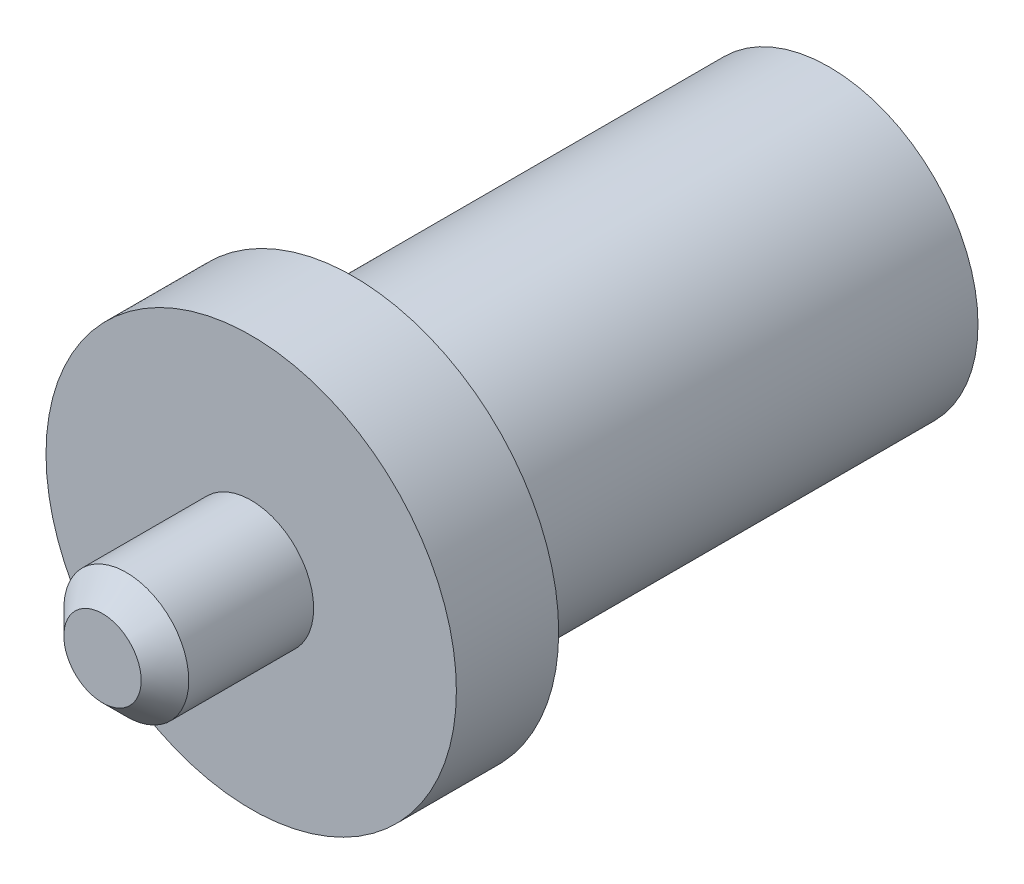
ISO-10303-21;
HEADER;
FILE_DESCRIPTION(('STEP AP214'),'2;1');
FILE_NAME('part.step','',(''),(''),'','','');
FILE_SCHEMA(('AUTOMOTIVE_DESIGN { 1 0 10303 214 1 1 1 1 }'));
ENDSEC;
DATA;
#1=APPLICATION_CONTEXT('core data for automotive mechanical design processes');
#2=APPLICATION_PROTOCOL_DEFINITION('international standard','automotive_design',2000,#1);
#3=PRODUCT_CONTEXT('',#1,'mechanical');
#4=PRODUCT('Part','Part','',(#3));
#5=PRODUCT_RELATED_PRODUCT_CATEGORY('part','',(#4));
#6=PRODUCT_DEFINITION_FORMATION('','',#4);
#7=PRODUCT_DEFINITION_CONTEXT('part definition',#1,'design');
#8=PRODUCT_DEFINITION('design','',#6,#7);
#9=PRODUCT_DEFINITION_SHAPE('','',#8);
#10=(LENGTH_UNIT() NAMED_UNIT(*) SI_UNIT(.MILLI.,.METRE.));
#11=(NAMED_UNIT(*) PLANE_ANGLE_UNIT() SI_UNIT($,.RADIAN.));
#12=(NAMED_UNIT(*) SI_UNIT($,.STERADIAN.) SOLID_ANGLE_UNIT());
#13=UNCERTAINTY_MEASURE_WITH_UNIT(LENGTH_MEASURE(1.E-05),#10,'distance_accuracy_value','');
#14=(GEOMETRIC_REPRESENTATION_CONTEXT(3) GLOBAL_UNCERTAINTY_ASSIGNED_CONTEXT((#13)) GLOBAL_UNIT_ASSIGNED_CONTEXT((#10,
#11,#12)) REPRESENTATION_CONTEXT('',''));
#15=CARTESIAN_POINT('',(0.,0.,0.));
#16=DIRECTION('',(0.,0.,1.));
#17=DIRECTION('',(1.,0.,0.));
#18=AXIS2_PLACEMENT_3D('',#15,#16,#17);
#19=CARTESIAN_POINT('',(0.,0.,0.));
#20=DIRECTION('',(0.,0.,1.));
#21=DIRECTION('',(1.,0.,0.));
#22=AXIS2_PLACEMENT_3D('',#19,#20,#21);
#23=PLANE('',#22);
#24=CARTESIAN_POINT('',(0.,0.,0.));
#25=DIRECTION('',(0.,0.,1.));
#26=DIRECTION('',(1.,0.,0.));
#27=AXIS2_PLACEMENT_3D('',#24,#25,#26);
#28=CIRCLE('',#27,3.45);
#29=CARTESIAN_POINT('',(3.45,0.,0.));
#30=VERTEX_POINT('',#29);
#31=EDGE_CURVE('E49',#30,#30,#28,.T.);
#32=ORIENTED_EDGE('',*,*,#31,.T.);
#33=EDGE_LOOP('',(#32));
#34=FACE_BOUND('',#33,.T.);
#35=CARTESIAN_POINT('',(0.,0.,0.));
#36=DIRECTION('',(0.,0.,1.));
#37=DIRECTION('',(1.,0.,0.));
#38=AXIS2_PLACEMENT_3D('',#35,#36,#37);
#39=CIRCLE('',#38,1.05);
#40=CARTESIAN_POINT('',(1.05,0.,0.));
#41=VERTEX_POINT('',#40);
#42=EDGE_CURVE('E57',#41,#41,#39,.T.);
#43=ORIENTED_EDGE('',*,*,#42,.F.);
#44=EDGE_LOOP('',(#43));
#45=FACE_BOUND('',#44,.T.);
#46=ADVANCED_FACE('F31',(#34,#45),#23,.T.);
#47=CARTESIAN_POINT('',(0.,0.,-1.72));
#48=DIRECTION('',(0.,0.,1.));
#49=DIRECTION('',(1.,0.,0.));
#50=AXIS2_PLACEMENT_3D('',#47,#48,#49);
#51=PLANE('',#50);
#52=CARTESIAN_POINT('',(0.,0.,-1.72));
#53=DIRECTION('',(0.,0.,1.));
#54=DIRECTION('',(1.,0.,0.));
#55=AXIS2_PLACEMENT_3D('',#52,#53,#54);
#56=CIRCLE('',#55,3.45);
#57=CARTESIAN_POINT('',(3.45,0.,-1.72));
#58=VERTEX_POINT('',#57);
#59=EDGE_CURVE('E46',#58,#58,#56,.T.);
#60=ORIENTED_EDGE('',*,*,#59,.F.);
#61=EDGE_LOOP('',(#60));
#62=FACE_BOUND('',#61,.T.);
#63=CARTESIAN_POINT('',(0.,0.,-1.72));
#64=DIRECTION('',(0.,0.,1.));
#65=DIRECTION('',(1.,0.,0.));
#66=AXIS2_PLACEMENT_3D('',#63,#64,#65);
#67=CIRCLE('',#66,2.5);
#68=CARTESIAN_POINT('',(2.5,0.,-1.72));
#69=VERTEX_POINT('',#68);
#70=EDGE_CURVE('E42',#69,#69,#67,.F.);
#71=ORIENTED_EDGE('',*,*,#70,.F.);
#72=EDGE_LOOP('',(#71));
#73=FACE_BOUND('',#72,.T.);
#74=ADVANCED_FACE('F64',(#62,#73),#51,.F.);
#75=CARTESIAN_POINT('',(0.,0.,-1.72));
#76=DIRECTION('',(0.,0.,1.));
#77=DIRECTION('',(1.,0.,0.));
#78=AXIS2_PLACEMENT_3D('',#75,#76,#77);
#79=CYLINDRICAL_SURFACE('',#78,3.45);
#80=ORIENTED_EDGE('',*,*,#59,.T.);
#81=EDGE_LOOP('',(#80));
#82=FACE_BOUND('',#81,.T.);
#83=ORIENTED_EDGE('',*,*,#31,.F.);
#84=EDGE_LOOP('',(#83));
#85=FACE_BOUND('',#84,.T.);
#86=ADVANCED_FACE('F70',(#82,#85),#79,.T.);
#87=CARTESIAN_POINT('',(0.,0.,-9.72));
#88=DIRECTION('',(0.,0.,1.));
#89=DIRECTION('',(1.,0.,0.));
#90=AXIS2_PLACEMENT_3D('',#87,#88,#89);
#91=CYLINDRICAL_SURFACE('',#90,2.5);
#92=CARTESIAN_POINT('',(0.,0.,-9.72));
#93=DIRECTION('',(0.,0.,-1.));
#94=DIRECTION('',(-1.,0.,0.));
#95=AXIS2_PLACEMENT_3D('',#92,#93,#94);
#96=CIRCLE('',#95,2.5);
#97=CARTESIAN_POINT('',(-2.5,0.,-9.72));
#98=VERTEX_POINT('',#97);
#99=EDGE_CURVE('E52',#98,#98,#96,.T.);
#100=ORIENTED_EDGE('',*,*,#99,.F.);
#101=EDGE_LOOP('',(#100));
#102=FACE_BOUND('',#101,.T.);
#103=ORIENTED_EDGE('',*,*,#70,.T.);
#104=EDGE_LOOP('',(#103));
#105=FACE_BOUND('',#104,.T.);
#106=ADVANCED_FACE('F75',(#102,#105),#91,.T.);
#107=CARTESIAN_POINT('',(0.,0.,-9.72));
#108=DIRECTION('',(0.,0.,-1.));
#109=DIRECTION('',(-1.,0.,0.));
#110=AXIS2_PLACEMENT_3D('',#107,#108,#109);
#111=PLANE('',#110);
#112=ORIENTED_EDGE('',*,*,#99,.T.);
#113=EDGE_LOOP('',(#112));
#114=FACE_BOUND('',#113,.T.);
#115=ADVANCED_FACE('F80',(#114),#111,.T.);
#116=CARTESIAN_POINT('',(0.,0.,2.5));
#117=DIRECTION('',(0.,0.,-1.));
#118=DIRECTION('',(-1.,0.,0.));
#119=AXIS2_PLACEMENT_3D('',#116,#117,#118);
#120=CYLINDRICAL_SURFACE('',#119,1.05);
#121=CARTESIAN_POINT('',(0.,0.,2.1));
#122=DIRECTION('',(0.,0.,1.));
#123=DIRECTION('',(1.,0.,0.));
#124=AXIS2_PLACEMENT_3D('',#121,#122,#123);
#125=CIRCLE('',#124,1.05);
#126=CARTESIAN_POINT('',(1.05,0.,2.1));
#127=VERTEX_POINT('',#126);
#128=EDGE_CURVE('E10',#127,#127,#125,.F.);
#129=ORIENTED_EDGE('',*,*,#128,.T.);
#130=EDGE_LOOP('',(#129));
#131=FACE_BOUND('',#130,.T.);
#132=ORIENTED_EDGE('',*,*,#42,.T.);
#133=EDGE_LOOP('',(#132));
#134=FACE_BOUND('',#133,.T.);
#135=ADVANCED_FACE('F61',(#131,#134),#120,.T.);
#136=CARTESIAN_POINT('',(0.,0.,2.5));
#137=DIRECTION('',(0.,0.,1.));
#138=DIRECTION('',(1.,0.,0.));
#139=AXIS2_PLACEMENT_3D('',#136,#137,#138);
#140=PLANE('',#139);
#141=CARTESIAN_POINT('',(0.,0.,2.5));
#142=DIRECTION('',(0.,0.,1.));
#143=DIRECTION('',(1.,0.,0.));
#144=AXIS2_PLACEMENT_3D('',#141,#142,#143);
#145=CIRCLE('',#144,0.650000000000003);
#146=CARTESIAN_POINT('',(0.650000000000003,0.,2.5));
#147=VERTEX_POINT('',#146);
#148=EDGE_CURVE('E38',#147,#147,#145,.T.);
#149=ORIENTED_EDGE('',*,*,#148,.T.);
#150=EDGE_LOOP('',(#149));
#151=FACE_BOUND('',#150,.T.);
#152=ADVANCED_FACE('F97',(#151),#140,.T.);
#153=CARTESIAN_POINT('',(0.,0.,2.5));
#154=DIRECTION('',(0.,0.,-1.));
#155=DIRECTION('',(-1.,0.,0.));
#156=AXIS2_PLACEMENT_3D('',#153,#154,#155);
#157=CONICAL_SURFACE('',#156,0.650000000000003,0.785398163397447);
#158=ORIENTED_EDGE('',*,*,#128,.F.);
#159=EDGE_LOOP('',(#158));
#160=FACE_BOUND('',#159,.T.);
#161=ORIENTED_EDGE('',*,*,#148,.F.);
#162=EDGE_LOOP('',(#161));
#163=FACE_BOUND('',#162,.T.);
#164=ADVANCED_FACE('F33',(#160,#163),#157,.T.);
#165=CLOSED_SHELL('',(#46,#74,#86,#106,#115,#135,#152,#164));
#166=MANIFOLD_SOLID_BREP('B2',#165);
#167=ADVANCED_BREP_SHAPE_REPRESENTATION('',(#18,#166),#14);
#168=SHAPE_DEFINITION_REPRESENTATION(#9,#167);
ENDSEC;
END-ISO-10303-21;
